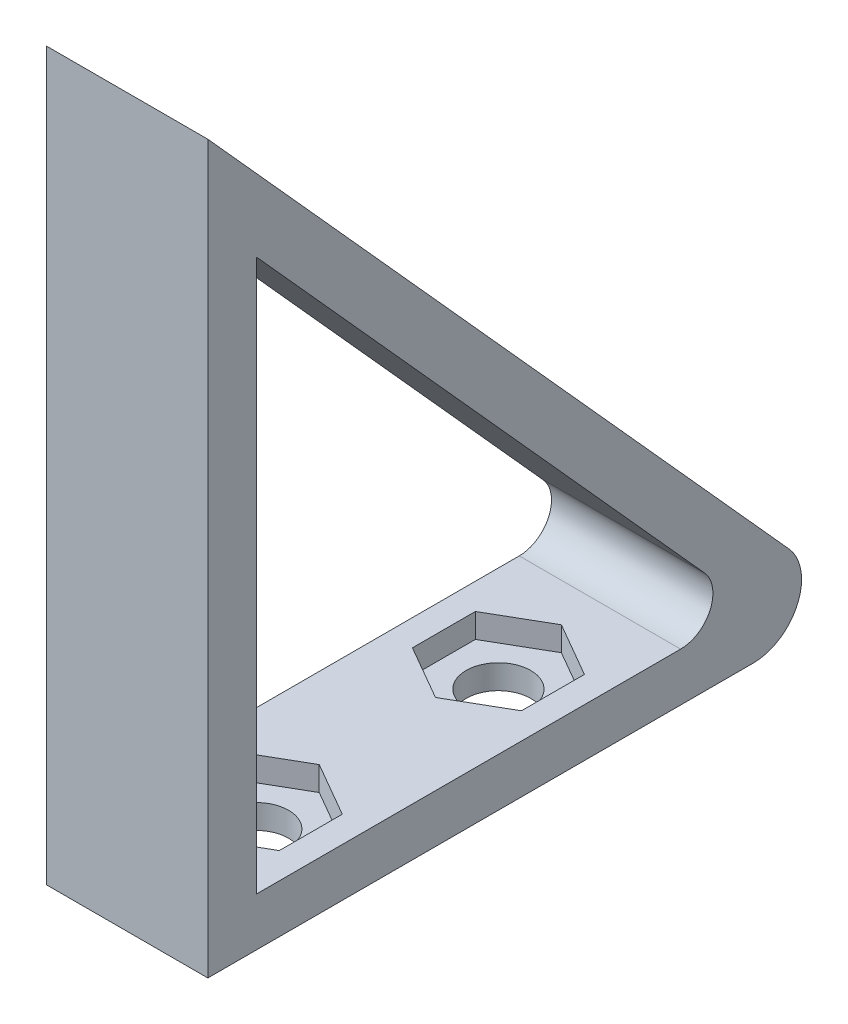
ISO-10303-21;
HEADER;
FILE_DESCRIPTION(('STEP AP214'),'2;1');
FILE_NAME('part.step','',(''),(''),'','','');
FILE_SCHEMA(('AUTOMOTIVE_DESIGN { 1 0 10303 214 1 1 1 1 }'));
ENDSEC;
DATA;
#1=APPLICATION_CONTEXT('core data for automotive mechanical design processes');
#2=APPLICATION_PROTOCOL_DEFINITION('international standard','automotive_design',2000,#1);
#3=PRODUCT_CONTEXT('',#1,'mechanical');
#4=PRODUCT('Part','Part','',(#3));
#5=PRODUCT_RELATED_PRODUCT_CATEGORY('part','',(#4));
#6=PRODUCT_DEFINITION_FORMATION('','',#4);
#7=PRODUCT_DEFINITION_CONTEXT('part definition',#1,'design');
#8=PRODUCT_DEFINITION('design','',#6,#7);
#9=PRODUCT_DEFINITION_SHAPE('','',#8);
#10=(LENGTH_UNIT() NAMED_UNIT(*) SI_UNIT(.MILLI.,.METRE.));
#11=(NAMED_UNIT(*) PLANE_ANGLE_UNIT() SI_UNIT($,.RADIAN.));
#12=(NAMED_UNIT(*) SI_UNIT($,.STERADIAN.) SOLID_ANGLE_UNIT());
#13=UNCERTAINTY_MEASURE_WITH_UNIT(LENGTH_MEASURE(1.E-05),#10,'distance_accuracy_value','');
#14=(GEOMETRIC_REPRESENTATION_CONTEXT(3) GLOBAL_UNCERTAINTY_ASSIGNED_CONTEXT((#13)) GLOBAL_UNIT_ASSIGNED_CONTEXT((#10,
#11,#12)) REPRESENTATION_CONTEXT('',''));
#15=CARTESIAN_POINT('',(0.,0.,0.));
#16=DIRECTION('',(0.,0.,1.));
#17=DIRECTION('',(1.,0.,0.));
#18=AXIS2_PLACEMENT_3D('',#15,#16,#17);
#19=CARTESIAN_POINT('',(-5.,3.,-23.));
#20=DIRECTION('',(0.,-1.,0.));
#21=DIRECTION('',(0.,0.,-1.));
#22=AXIS2_PLACEMENT_3D('',#19,#20,#21);
#23=CYLINDRICAL_SURFACE('',#22,2.00000000000001);
#24=CARTESIAN_POINT('',(-5.,0.,-23.));
#25=DIRECTION('',(0.,-1.,0.));
#26=DIRECTION('',(0.,0.,-1.));
#27=AXIS2_PLACEMENT_3D('',#24,#25,#26);
#28=CIRCLE('',#27,2.00000000000001);
#29=CARTESIAN_POINT('',(-5.,0.,-25.));
#30=VERTEX_POINT('',#29);
#31=EDGE_CURVE('E326',#30,#30,#28,.T.);
#32=ORIENTED_EDGE('',*,*,#31,.T.);
#33=EDGE_LOOP('',(#32));
#34=FACE_BOUND('',#33,.T.);
#35=CARTESIAN_POINT('',(-5.,1.5,-23.));
#36=DIRECTION('',(0.,1.,0.));
#37=DIRECTION('',(0.,0.,1.));
#38=AXIS2_PLACEMENT_3D('',#35,#36,#37);
#39=CIRCLE('',#38,2.00000000000001);
#40=CARTESIAN_POINT('',(-5.,1.5,-21.));
#41=VERTEX_POINT('',#40);
#42=EDGE_CURVE('E330',#41,#41,#39,.F.);
#43=ORIENTED_EDGE('',*,*,#42,.F.);
#44=EDGE_LOOP('',(#43));
#45=FACE_BOUND('',#44,.T.);
#46=ADVANCED_FACE('F39',(#34,#45),#23,.F.);
#47=CARTESIAN_POINT('',(-5.,3.,-8.));
#48=DIRECTION('',(0.,-1.,0.));
#49=DIRECTION('',(0.,0.,-1.));
#50=AXIS2_PLACEMENT_3D('',#47,#48,#49);
#51=CYLINDRICAL_SURFACE('',#50,2.);
#52=CARTESIAN_POINT('',(-5.,0.,-8.));
#53=DIRECTION('',(0.,-1.,0.));
#54=DIRECTION('',(0.,0.,-1.));
#55=AXIS2_PLACEMENT_3D('',#52,#53,#54);
#56=CIRCLE('',#55,2.);
#57=CARTESIAN_POINT('',(-5.,0.,-10.));
#58=VERTEX_POINT('',#57);
#59=EDGE_CURVE('E321',#58,#58,#56,.T.);
#60=ORIENTED_EDGE('',*,*,#59,.T.);
#61=EDGE_LOOP('',(#60));
#62=FACE_BOUND('',#61,.T.);
#63=CARTESIAN_POINT('',(-5.,1.5,-8.));
#64=DIRECTION('',(0.,1.,0.));
#65=DIRECTION('',(0.,0.,1.));
#66=AXIS2_PLACEMENT_3D('',#63,#64,#65);
#67=CIRCLE('',#66,2.);
#68=CARTESIAN_POINT('',(-5.,1.5,-6.));
#69=VERTEX_POINT('',#68);
#70=EDGE_CURVE('E244',#69,#69,#67,.F.);
#71=ORIENTED_EDGE('',*,*,#70,.F.);
#72=EDGE_LOOP('',(#71));
#73=FACE_BOUND('',#72,.T.);
#74=ADVANCED_FACE('F434',(#62,#73),#51,.F.);
#75=CARTESIAN_POINT('',(-10.,0.,-40.5181819934023));
#76=DIRECTION('',(0.,-1.,0.));
#77=DIRECTION('',(0.,0.,-1.));
#78=AXIS2_PLACEMENT_3D('',#75,#76,#77);
#79=PLANE('',#78);
#80=ORIENTED_EDGE('',*,*,#59,.F.);
#81=EDGE_LOOP('',(#80));
#82=FACE_BOUND('',#81,.T.);
#83=ORIENTED_EDGE('',*,*,#31,.F.);
#84=EDGE_LOOP('',(#83));
#85=FACE_BOUND('',#84,.T.);
#86=DIRECTION('',(0.,0.,-1.));
#87=VECTOR('',#86,1.);
#88=CARTESIAN_POINT('',(-10.,0.,-40.5181819934023));
#89=LINE('',#88,#87);
#90=CARTESIAN_POINT('',(-10.,0.,0.));
#91=VERTEX_POINT('',#90);
#92=CARTESIAN_POINT('',(-10.,0.,-33.7800716716897));
#93=VERTEX_POINT('',#92);
#94=EDGE_CURVE('E358',#91,#93,#89,.T.);
#95=ORIENTED_EDGE('',*,*,#94,.T.);
#96=DIRECTION('',(1.,0.,0.));
#97=VECTOR('',#96,1.);
#98=CARTESIAN_POINT('',(-10.,0.,-33.7800716716897));
#99=LINE('',#98,#97);
#100=CARTESIAN_POINT('',(0.,0.,-33.7800716716897));
#101=VERTEX_POINT('',#100);
#102=EDGE_CURVE('E383',#93,#101,#99,.T.);
#103=ORIENTED_EDGE('',*,*,#102,.T.);
#104=DIRECTION('',(0.,0.,-1.));
#105=VECTOR('',#104,1.);
#106=CARTESIAN_POINT('',(0.,0.,-40.5181819934023));
#107=LINE('',#106,#105);
#108=CARTESIAN_POINT('',(0.,0.,0.));
#109=VERTEX_POINT('',#108);
#110=EDGE_CURVE('E354',#109,#101,#107,.T.);
#111=ORIENTED_EDGE('',*,*,#110,.F.);
#112=DIRECTION('',(1.,0.,0.));
#113=VECTOR('',#112,1.);
#114=CARTESIAN_POINT('',(-10.,0.,0.));
#115=LINE('',#114,#113);
#116=EDGE_CURVE('E380',#91,#109,#115,.T.);
#117=ORIENTED_EDGE('',*,*,#116,.F.);
#118=EDGE_LOOP('',(#95,#103,#111,#117));
#119=FACE_BOUND('',#118,.T.);
#120=ADVANCED_FACE('F440',(#82,#85,#119),#79,.T.);
#121=CARTESIAN_POINT('',(-10.,0.,0.));
#122=DIRECTION('',(0.,0.,1.));
#123=DIRECTION('',(1.,0.,0.));
#124=AXIS2_PLACEMENT_3D('',#121,#122,#123);
#125=PLANE('',#124);
#126=DIRECTION('',(0.,-1.,0.));
#127=VECTOR('',#126,1.);
#128=CARTESIAN_POINT('',(0.,0.,0.));
#129=LINE('',#128,#127);
#130=CARTESIAN_POINT('',(0.,45.,0.));
#131=VERTEX_POINT('',#130);
#132=EDGE_CURVE('E363',#131,#109,#129,.T.);
#133=ORIENTED_EDGE('',*,*,#132,.F.);
#134=DIRECTION('',(1.,0.,0.));
#135=VECTOR('',#134,1.);
#136=CARTESIAN_POINT('',(-10.,45.,0.));
#137=LINE('',#136,#135);
#138=CARTESIAN_POINT('',(-10.,45.,0.));
#139=VERTEX_POINT('',#138);
#140=EDGE_CURVE('E370',#139,#131,#137,.T.);
#141=ORIENTED_EDGE('',*,*,#140,.F.);
#142=DIRECTION('',(0.,-1.,0.));
#143=VECTOR('',#142,1.);
#144=CARTESIAN_POINT('',(-10.,0.,0.));
#145=LINE('',#144,#143);
#146=EDGE_CURVE('E366',#139,#91,#145,.T.);
#147=ORIENTED_EDGE('',*,*,#146,.T.);
#148=ORIENTED_EDGE('',*,*,#116,.T.);
#149=EDGE_LOOP('',(#133,#141,#147,#148));
#150=FACE_BOUND('',#149,.T.);
#151=ADVANCED_FACE('F460',(#150),#125,.T.);
#152=CARTESIAN_POINT('',(-10.,45.,0.));
#153=DIRECTION('',(0.,0.669130606358854,-0.743144825477398));
#154=DIRECTION('',(0.,0.743144825477398,0.669130606358854));
#155=AXIS2_PLACEMENT_3D('',#152,#153,#154);
#156=PLANE('',#155);
#157=DIRECTION('',(0.,0.743144825477398,0.669130606358854));
#158=VECTOR('',#157,1.);
#159=CARTESIAN_POINT('',(0.,45.,0.));
#160=LINE('',#159,#158);
#161=CARTESIAN_POINT('',(0.,5.00739181907657,-36.0095061481219));
#162=VERTEX_POINT('',#161);
#163=EDGE_CURVE('E374',#162,#131,#160,.T.);
#164=ORIENTED_EDGE('',*,*,#163,.F.);
#165=DIRECTION('',(1.,0.,0.));
#166=VECTOR('',#165,1.);
#167=CARTESIAN_POINT('',(-10.,5.00739181907656,-36.0095061481219));
#168=LINE('',#167,#166);
#169=CARTESIAN_POINT('',(-10.,5.00739181907657,-36.0095061481219));
#170=VERTEX_POINT('',#169);
#171=EDGE_CURVE('E399',#162,#170,#168,.F.);
#172=ORIENTED_EDGE('',*,*,#171,.T.);
#173=DIRECTION('',(0.,0.743144825477398,0.669130606358854));
#174=VECTOR('',#173,1.);
#175=CARTESIAN_POINT('',(-10.,45.,0.));
#176=LINE('',#175,#174);
#177=EDGE_CURVE('E362',#170,#139,#176,.T.);
#178=ORIENTED_EDGE('',*,*,#177,.T.);
#179=ORIENTED_EDGE('',*,*,#140,.T.);
#180=EDGE_LOOP('',(#164,#172,#178,#179));
#181=FACE_BOUND('',#180,.T.);
#182=ADVANCED_FACE('F457',(#181),#156,.T.);
#183=CARTESIAN_POINT('',(-10.,0.,0.));
#184=DIRECTION('',(-1.,0.,0.));
#185=DIRECTION('',(0.,0.,1.));
#186=AXIS2_PLACEMENT_3D('',#183,#184,#185);
#187=PLANE('',#186);
#188=DIRECTION('',(0.,0.,-1.));
#189=VECTOR('',#188,1.);
#190=CARTESIAN_POINT('',(-10.,3.,-3.));
#191=LINE('',#190,#189);
#192=CARTESIAN_POINT('',(-10.,3.,-3.));
#193=VERTEX_POINT('',#192);
#194=CARTESIAN_POINT('',(-10.,3.,-29.2879981238814));
#195=VERTEX_POINT('',#194);
#196=EDGE_CURVE('E331',#193,#195,#191,.T.);
#197=ORIENTED_EDGE('',*,*,#196,.T.);
#198=CARTESIAN_POINT('',(-10.,5.,-29.2879981238814));
#199=DIRECTION('',(-1.,0.,0.));
#200=DIRECTION('',(0.,0.,1.));
#201=AXIS2_PLACEMENT_3D('',#198,#199,#200);
#202=CIRCLE('',#201,2.);
#203=CARTESIAN_POINT('',(-10.,6.33826121271771,-30.7742877748362));
#204=VERTEX_POINT('',#203);
#205=EDGE_CURVE('E11',#195,#204,#202,.F.);
#206=ORIENTED_EDGE('',*,*,#205,.T.);
#207=DIRECTION('',(0.,0.743144825477398,0.669130606358854));
#208=VECTOR('',#207,1.);
#209=CARTESIAN_POINT('',(-10.,3.,-33.7800716716898));
#210=LINE('',#209,#208);
#211=CARTESIAN_POINT('',(-10.,37.1847328059185,-3.));
#212=VERTEX_POINT('',#211);
#213=EDGE_CURVE('E334',#204,#212,#210,.T.);
#214=ORIENTED_EDGE('',*,*,#213,.T.);
#215=DIRECTION('',(0.,-1.,0.));
#216=VECTOR('',#215,1.);
#217=CARTESIAN_POINT('',(-10.,37.1847328059185,-3.));
#218=LINE('',#217,#216);
#219=EDGE_CURVE('E338',#212,#193,#218,.T.);
#220=ORIENTED_EDGE('',*,*,#219,.T.);
#221=EDGE_LOOP('',(#197,#206,#214,#220));
#222=FACE_BOUND('',#221,.T.);
#223=ORIENTED_EDGE('',*,*,#177,.F.);
#224=CARTESIAN_POINT('',(-10.,3.,-33.7800716716897));
#225=DIRECTION('',(-1.,0.,0.));
#226=DIRECTION('',(0.,0.,1.));
#227=AXIS2_PLACEMENT_3D('',#224,#225,#226);
#228=CIRCLE('',#227,3.);
#229=EDGE_CURVE('E402',#170,#93,#228,.T.);
#230=ORIENTED_EDGE('',*,*,#229,.T.);
#231=ORIENTED_EDGE('',*,*,#94,.F.);
#232=ORIENTED_EDGE('',*,*,#146,.F.);
#233=EDGE_LOOP('',(#223,#230,#231,#232));
#234=FACE_BOUND('',#233,.T.);
#235=ADVANCED_FACE('F425',(#222,#234),#187,.T.);
#236=CARTESIAN_POINT('',(0.,0.,0.));
#237=DIRECTION('',(-1.,0.,0.));
#238=DIRECTION('',(0.,0.,1.));
#239=AXIS2_PLACEMENT_3D('',#236,#237,#238);
#240=PLANE('',#239);
#241=DIRECTION('',(0.,0.743144825477398,0.669130606358854));
#242=VECTOR('',#241,1.);
#243=CARTESIAN_POINT('',(0.,3.,-33.7800716716898));
#244=LINE('',#243,#242);
#245=CARTESIAN_POINT('',(0.,6.33826121271771,-30.7742877748362));
#246=VERTEX_POINT('',#245);
#247=CARTESIAN_POINT('',(0.,37.1847328059185,-3.));
#248=VERTEX_POINT('',#247);
#249=EDGE_CURVE('E345',#246,#248,#244,.T.);
#250=ORIENTED_EDGE('',*,*,#249,.F.);
#251=CARTESIAN_POINT('',(0.,5.,-29.2879981238814));
#252=DIRECTION('',(-1.,0.,0.));
#253=DIRECTION('',(0.,0.,1.));
#254=AXIS2_PLACEMENT_3D('',#251,#252,#253);
#255=CIRCLE('',#254,2.);
#256=CARTESIAN_POINT('',(0.,3.,-29.2879981238814));
#257=VERTEX_POINT('',#256);
#258=EDGE_CURVE('E48',#246,#257,#255,.T.);
#259=ORIENTED_EDGE('',*,*,#258,.T.);
#260=DIRECTION('',(0.,0.,-1.));
#261=VECTOR('',#260,1.);
#262=CARTESIAN_POINT('',(0.,3.,-3.));
#263=LINE('',#262,#261);
#264=CARTESIAN_POINT('',(0.,3.,-3.));
#265=VERTEX_POINT('',#264);
#266=EDGE_CURVE('E325',#265,#257,#263,.T.);
#267=ORIENTED_EDGE('',*,*,#266,.F.);
#268=DIRECTION('',(0.,-1.,0.));
#269=VECTOR('',#268,1.);
#270=CARTESIAN_POINT('',(0.,37.1847328059185,-3.));
#271=LINE('',#270,#269);
#272=EDGE_CURVE('E335',#248,#265,#271,.T.);
#273=ORIENTED_EDGE('',*,*,#272,.F.);
#274=EDGE_LOOP('',(#250,#259,#267,#273));
#275=FACE_BOUND('',#274,.T.);
#276=ORIENTED_EDGE('',*,*,#110,.T.);
#277=CARTESIAN_POINT('',(0.,3.,-33.7800716716897));
#278=DIRECTION('',(-1.,0.,0.));
#279=DIRECTION('',(0.,0.,1.));
#280=AXIS2_PLACEMENT_3D('',#277,#278,#279);
#281=CIRCLE('',#280,3.);
#282=EDGE_CURVE('E396',#101,#162,#281,.F.);
#283=ORIENTED_EDGE('',*,*,#282,.T.);
#284=ORIENTED_EDGE('',*,*,#163,.T.);
#285=ORIENTED_EDGE('',*,*,#132,.T.);
#286=EDGE_LOOP('',(#276,#283,#284,#285));
#287=FACE_BOUND('',#286,.T.);
#288=ADVANCED_FACE('F419',(#275,#287),#240,.F.);
#289=CARTESIAN_POINT('',(-10.,3.,-3.));
#290=DIRECTION('',(0.,-1.,0.));
#291=DIRECTION('',(0.,0.,-1.));
#292=AXIS2_PLACEMENT_3D('',#289,#290,#291);
#293=PLANE('',#292);
#294=DIRECTION('',(0.866025403784439,0.,-0.5));
#295=VECTOR('',#294,1.);
#296=CARTESIAN_POINT('',(-5.,3.,-19.1));
#297=LINE('',#296,#295);
#298=CARTESIAN_POINT('',(-5.,3.,-19.1));
#299=VERTEX_POINT('',#298);
#300=CARTESIAN_POINT('',(-1.62250092524069,3.,-21.05));
#301=VERTEX_POINT('',#300);
#302=EDGE_CURVE('E226',#299,#301,#297,.T.);
#303=ORIENTED_EDGE('',*,*,#302,.F.);
#304=DIRECTION('',(0.866025403784439,0.,0.5));
#305=VECTOR('',#304,1.);
#306=CARTESIAN_POINT('',(-8.3774990747593,3.,-21.05));
#307=LINE('',#306,#305);
#308=CARTESIAN_POINT('',(-8.3774990747593,3.,-21.05));
#309=VERTEX_POINT('',#308);
#310=EDGE_CURVE('E184',#309,#299,#307,.T.);
#311=ORIENTED_EDGE('',*,*,#310,.F.);
#312=DIRECTION('',(0.,0.,1.));
#313=VECTOR('',#312,1.);
#314=CARTESIAN_POINT('',(-8.3774990747593,3.,-24.95));
#315=LINE('',#314,#313);
#316=CARTESIAN_POINT('',(-8.3774990747593,3.,-24.95));
#317=VERTEX_POINT('',#316);
#318=EDGE_CURVE('E206',#317,#309,#315,.T.);
#319=ORIENTED_EDGE('',*,*,#318,.F.);
#320=DIRECTION('',(-0.866025403784439,0.,0.5));
#321=VECTOR('',#320,1.);
#322=CARTESIAN_POINT('',(-4.99999999999999,3.,-26.9));
#323=LINE('',#322,#321);
#324=CARTESIAN_POINT('',(-4.99999999999999,3.,-26.9));
#325=VERTEX_POINT('',#324);
#326=EDGE_CURVE('E210',#325,#317,#323,.T.);
#327=ORIENTED_EDGE('',*,*,#326,.F.);
#328=DIRECTION('',(-0.866025403784439,0.,-0.5));
#329=VECTOR('',#328,1.);
#330=CARTESIAN_POINT('',(-1.62250092524069,3.,-24.95));
#331=LINE('',#330,#329);
#332=CARTESIAN_POINT('',(-1.62250092524069,3.,-24.95));
#333=VERTEX_POINT('',#332);
#334=EDGE_CURVE('E234',#333,#325,#331,.T.);
#335=ORIENTED_EDGE('',*,*,#334,.F.);
#336=DIRECTION('',(0.,0.,-1.));
#337=VECTOR('',#336,1.);
#338=CARTESIAN_POINT('',(-1.62250092524069,3.,-21.05));
#339=LINE('',#338,#337);
#340=EDGE_CURVE('E230',#301,#333,#339,.T.);
#341=ORIENTED_EDGE('',*,*,#340,.F.);
#342=EDGE_LOOP('',(#303,#311,#319,#327,#335,#341));
#343=FACE_BOUND('',#342,.T.);
#344=DIRECTION('',(-0.866025403784438,0.,0.500000000000001));
#345=VECTOR('',#344,1.);
#346=CARTESIAN_POINT('',(-5.,3.,-11.9));
#347=LINE('',#346,#345);
#348=CARTESIAN_POINT('',(-5.,3.,-11.9));
#349=VERTEX_POINT('',#348);
#350=CARTESIAN_POINT('',(-8.37749907475931,3.,-9.95));
#351=VERTEX_POINT('',#350);
#352=EDGE_CURVE('E285',#349,#351,#347,.T.);
#353=ORIENTED_EDGE('',*,*,#352,.F.);
#354=DIRECTION('',(-0.866025403784439,0.,-0.5));
#355=VECTOR('',#354,1.);
#356=CARTESIAN_POINT('',(-1.62250092524069,3.,-9.95));
#357=LINE('',#356,#355);
#358=CARTESIAN_POINT('',(-1.62250092524069,3.,-9.95));
#359=VERTEX_POINT('',#358);
#360=EDGE_CURVE('E282',#359,#349,#357,.T.);
#361=ORIENTED_EDGE('',*,*,#360,.F.);
#362=DIRECTION('',(0.,0.,-1.));
#363=VECTOR('',#362,1.);
#364=CARTESIAN_POINT('',(-1.62250092524069,3.,-6.05));
#365=LINE('',#364,#363);
#366=CARTESIAN_POINT('',(-1.62250092524069,3.,-6.05));
#367=VERTEX_POINT('',#366);
#368=EDGE_CURVE('E261',#367,#359,#365,.T.);
#369=ORIENTED_EDGE('',*,*,#368,.F.);
#370=DIRECTION('',(0.866025403784439,0.,-0.5));
#371=VECTOR('',#370,1.);
#372=CARTESIAN_POINT('',(-5.,3.,-4.1));
#373=LINE('',#372,#371);
#374=CARTESIAN_POINT('',(-5.,3.,-4.1));
#375=VERTEX_POINT('',#374);
#376=EDGE_CURVE('E297',#375,#367,#373,.T.);
#377=ORIENTED_EDGE('',*,*,#376,.F.);
#378=DIRECTION('',(0.866025403784439,0.,0.5));
#379=VECTOR('',#378,1.);
#380=CARTESIAN_POINT('',(-8.37749907475931,3.,-6.05));
#381=LINE('',#380,#379);
#382=CARTESIAN_POINT('',(-8.37749907475931,3.,-6.05));
#383=VERTEX_POINT('',#382);
#384=EDGE_CURVE('E293',#383,#375,#381,.T.);
#385=ORIENTED_EDGE('',*,*,#384,.F.);
#386=DIRECTION('',(0.,0.,1.));
#387=VECTOR('',#386,1.);
#388=CARTESIAN_POINT('',(-8.37749907475931,3.,-9.95));
#389=LINE('',#388,#387);
#390=EDGE_CURVE('E289',#351,#383,#389,.T.);
#391=ORIENTED_EDGE('',*,*,#390,.F.);
#392=EDGE_LOOP('',(#353,#361,#369,#377,#385,#391));
#393=FACE_BOUND('',#392,.T.);
#394=ORIENTED_EDGE('',*,*,#266,.T.);
#395=DIRECTION('',(1.,0.,0.));
#396=VECTOR('',#395,1.);
#397=CARTESIAN_POINT('',(-10.,3.,-29.2879981238814));
#398=LINE('',#397,#396);
#399=EDGE_CURVE('E55',#257,#195,#398,.F.);
#400=ORIENTED_EDGE('',*,*,#399,.T.);
#401=ORIENTED_EDGE('',*,*,#196,.F.);
#402=DIRECTION('',(1.,0.,0.));
#403=VECTOR('',#402,1.);
#404=CARTESIAN_POINT('',(-10.,3.,-3.));
#405=LINE('',#404,#403);
#406=EDGE_CURVE('E351',#193,#265,#405,.T.);
#407=ORIENTED_EDGE('',*,*,#406,.T.);
#408=EDGE_LOOP('',(#394,#400,#401,#407));
#409=FACE_BOUND('',#408,.T.);
#410=ADVANCED_FACE('F448',(#343,#393,#409),#293,.F.);
#411=CARTESIAN_POINT('',(-10.,37.1847328059185,-3.));
#412=DIRECTION('',(0.,0.,1.));
#413=DIRECTION('',(0.,-1.,0.));
#414=AXIS2_PLACEMENT_3D('',#411,#412,#413);
#415=PLANE('',#414);
#416=ORIENTED_EDGE('',*,*,#272,.T.);
#417=ORIENTED_EDGE('',*,*,#406,.F.);
#418=ORIENTED_EDGE('',*,*,#219,.F.);
#419=DIRECTION('',(1.,0.,0.));
#420=VECTOR('',#419,1.);
#421=CARTESIAN_POINT('',(-10.,37.1847328059185,-3.));
#422=LINE('',#421,#420);
#423=EDGE_CURVE('E342',#212,#248,#422,.T.);
#424=ORIENTED_EDGE('',*,*,#423,.T.);
#425=EDGE_LOOP('',(#416,#417,#418,#424));
#426=FACE_BOUND('',#425,.T.);
#427=ADVANCED_FACE('F422',(#426),#415,.F.);
#428=CARTESIAN_POINT('',(-10.,3.,-33.7800716716898));
#429=DIRECTION('',(0.,0.669130606358854,-0.743144825477398));
#430=DIRECTION('',(0.,0.743144825477398,0.669130606358854));
#431=AXIS2_PLACEMENT_3D('',#428,#429,#430);
#432=PLANE('',#431);
#433=ORIENTED_EDGE('',*,*,#213,.F.);
#434=DIRECTION('',(1.,0.,0.));
#435=VECTOR('',#434,1.);
#436=CARTESIAN_POINT('',(0.,6.33826121271771,-30.7742877748362));
#437=LINE('',#436,#435);
#438=EDGE_CURVE('E405',#204,#246,#437,.T.);
#439=ORIENTED_EDGE('',*,*,#438,.T.);
#440=ORIENTED_EDGE('',*,*,#249,.T.);
#441=ORIENTED_EDGE('',*,*,#423,.F.);
#442=EDGE_LOOP('',(#433,#439,#440,#441));
#443=FACE_BOUND('',#442,.T.);
#444=ADVANCED_FACE('F414',(#443),#432,.F.);
#445=CARTESIAN_POINT('',(0.,1.5,0.));
#446=DIRECTION('',(0.,1.,0.));
#447=DIRECTION('',(0.,0.,1.));
#448=AXIS2_PLACEMENT_3D('',#445,#446,#447);
#449=PLANE('',#448);
#450=DIRECTION('',(-0.866025403784439,0.,-0.5));
#451=VECTOR('',#450,1.);
#452=CARTESIAN_POINT('',(-1.62250092524069,1.5,-9.95));
#453=LINE('',#452,#451);
#454=CARTESIAN_POINT('',(-1.62250092524069,1.5,-9.95));
#455=VERTEX_POINT('',#454);
#456=CARTESIAN_POINT('',(-5.,1.5,-11.9));
#457=VERTEX_POINT('',#456);
#458=EDGE_CURVE('E256',#455,#457,#453,.T.);
#459=ORIENTED_EDGE('',*,*,#458,.T.);
#460=DIRECTION('',(-0.866025403784438,0.,0.500000000000001));
#461=VECTOR('',#460,1.);
#462=CARTESIAN_POINT('',(-5.,1.5,-11.9));
#463=LINE('',#462,#461);
#464=CARTESIAN_POINT('',(-8.37749907475931,1.5,-9.95));
#465=VERTEX_POINT('',#464);
#466=EDGE_CURVE('E260',#457,#465,#463,.T.);
#467=ORIENTED_EDGE('',*,*,#466,.T.);
#468=DIRECTION('',(0.,0.,1.));
#469=VECTOR('',#468,1.);
#470=CARTESIAN_POINT('',(-8.37749907475931,1.5,-9.95));
#471=LINE('',#470,#469);
#472=CARTESIAN_POINT('',(-8.37749907475931,1.5,-6.05));
#473=VERTEX_POINT('',#472);
#474=EDGE_CURVE('E265',#465,#473,#471,.T.);
#475=ORIENTED_EDGE('',*,*,#474,.T.);
#476=DIRECTION('',(0.866025403784439,0.,0.5));
#477=VECTOR('',#476,1.);
#478=CARTESIAN_POINT('',(-8.37749907475931,1.5,-6.05));
#479=LINE('',#478,#477);
#480=CARTESIAN_POINT('',(-5.,1.5,-4.1));
#481=VERTEX_POINT('',#480);
#482=EDGE_CURVE('E269',#473,#481,#479,.T.);
#483=ORIENTED_EDGE('',*,*,#482,.T.);
#484=DIRECTION('',(0.866025403784439,0.,-0.5));
#485=VECTOR('',#484,1.);
#486=CARTESIAN_POINT('',(-5.,1.5,-4.1));
#487=LINE('',#486,#485);
#488=CARTESIAN_POINT('',(-1.62250092524069,1.5,-6.05));
#489=VERTEX_POINT('',#488);
#490=EDGE_CURVE('E273',#481,#489,#487,.T.);
#491=ORIENTED_EDGE('',*,*,#490,.T.);
#492=DIRECTION('',(0.,0.,-1.));
#493=VECTOR('',#492,1.);
#494=CARTESIAN_POINT('',(-1.62250092524069,1.5,-6.05));
#495=LINE('',#494,#493);
#496=EDGE_CURVE('E277',#489,#455,#495,.T.);
#497=ORIENTED_EDGE('',*,*,#496,.T.);
#498=EDGE_LOOP('',(#459,#467,#475,#483,#491,#497));
#499=FACE_BOUND('',#498,.T.);
#500=ORIENTED_EDGE('',*,*,#70,.T.);
#501=EDGE_LOOP('',(#500));
#502=FACE_BOUND('',#501,.T.);
#503=ADVANCED_FACE('F451',(#499,#502),#449,.T.);
#504=CARTESIAN_POINT('',(-1.62250092524069,1.5,-9.95));
#505=DIRECTION('',(0.5,0.,-0.866025403784439));
#506=DIRECTION('',(-0.866025403784439,0.,-0.5));
#507=AXIS2_PLACEMENT_3D('',#504,#505,#506);
#508=PLANE('',#507);
#509=ORIENTED_EDGE('',*,*,#360,.T.);
#510=DIRECTION('',(0.,1.,0.));
#511=VECTOR('',#510,1.);
#512=CARTESIAN_POINT('',(-5.,1.5,-11.9));
#513=LINE('',#512,#511);
#514=EDGE_CURVE('E281',#457,#349,#513,.T.);
#515=ORIENTED_EDGE('',*,*,#514,.F.);
#516=ORIENTED_EDGE('',*,*,#458,.F.);
#517=DIRECTION('',(0.,1.,0.));
#518=VECTOR('',#517,1.);
#519=CARTESIAN_POINT('',(-1.62250092524069,1.5,-9.95));
#520=LINE('',#519,#518);
#521=EDGE_CURVE('E227',#455,#359,#520,.T.);
#522=ORIENTED_EDGE('',*,*,#521,.T.);
#523=EDGE_LOOP('',(#509,#515,#516,#522));
#524=FACE_BOUND('',#523,.T.);
#525=ADVANCED_FACE('F489',(#524),#508,.F.);
#526=CARTESIAN_POINT('',(-1.62250092524069,1.5,-6.05));
#527=DIRECTION('',(1.,0.,0.));
#528=DIRECTION('',(0.,0.,-1.));
#529=AXIS2_PLACEMENT_3D('',#526,#527,#528);
#530=PLANE('',#529);
#531=ORIENTED_EDGE('',*,*,#368,.T.);
#532=ORIENTED_EDGE('',*,*,#521,.F.);
#533=ORIENTED_EDGE('',*,*,#496,.F.);
#534=DIRECTION('',(0.,1.,0.));
#535=VECTOR('',#534,1.);
#536=CARTESIAN_POINT('',(-1.62250092524069,1.5,-6.05));
#537=LINE('',#536,#535);
#538=EDGE_CURVE('E306',#489,#367,#537,.T.);
#539=ORIENTED_EDGE('',*,*,#538,.T.);
#540=EDGE_LOOP('',(#531,#532,#533,#539));
#541=FACE_BOUND('',#540,.T.);
#542=ADVANCED_FACE('F495',(#541),#530,.F.);
#543=CARTESIAN_POINT('',(-5.,1.5,-4.1));
#544=DIRECTION('',(0.5,0.,0.866025403784439));
#545=DIRECTION('',(0.866025403784439,0.,-0.5));
#546=AXIS2_PLACEMENT_3D('',#543,#544,#545);
#547=PLANE('',#546);
#548=ORIENTED_EDGE('',*,*,#376,.T.);
#549=ORIENTED_EDGE('',*,*,#538,.F.);
#550=ORIENTED_EDGE('',*,*,#490,.F.);
#551=DIRECTION('',(0.,1.,0.));
#552=VECTOR('',#551,1.);
#553=CARTESIAN_POINT('',(-5.,1.5,-4.1));
#554=LINE('',#553,#552);
#555=EDGE_CURVE('E309',#481,#375,#554,.T.);
#556=ORIENTED_EDGE('',*,*,#555,.T.);
#557=EDGE_LOOP('',(#548,#549,#550,#556));
#558=FACE_BOUND('',#557,.T.);
#559=ADVANCED_FACE('F502',(#558),#547,.F.);
#560=CARTESIAN_POINT('',(-8.37749907475931,1.5,-6.05));
#561=DIRECTION('',(-0.5,0.,0.866025403784438));
#562=DIRECTION('',(0.866025403784439,0.,0.5));
#563=AXIS2_PLACEMENT_3D('',#560,#561,#562);
#564=PLANE('',#563);
#565=ORIENTED_EDGE('',*,*,#384,.T.);
#566=ORIENTED_EDGE('',*,*,#555,.F.);
#567=ORIENTED_EDGE('',*,*,#482,.F.);
#568=DIRECTION('',(0.,1.,0.));
#569=VECTOR('',#568,1.);
#570=CARTESIAN_POINT('',(-8.37749907475931,1.5,-6.05));
#571=LINE('',#570,#569);
#572=EDGE_CURVE('E312',#473,#383,#571,.T.);
#573=ORIENTED_EDGE('',*,*,#572,.T.);
#574=EDGE_LOOP('',(#565,#566,#567,#573));
#575=FACE_BOUND('',#574,.T.);
#576=ADVANCED_FACE('F506',(#575),#564,.F.);
#577=CARTESIAN_POINT('',(-8.37749907475931,1.5,-9.95));
#578=DIRECTION('',(-1.,0.,0.));
#579=DIRECTION('',(0.,0.,1.));
#580=AXIS2_PLACEMENT_3D('',#577,#578,#579);
#581=PLANE('',#580);
#582=ORIENTED_EDGE('',*,*,#390,.T.);
#583=ORIENTED_EDGE('',*,*,#572,.F.);
#584=ORIENTED_EDGE('',*,*,#474,.F.);
#585=DIRECTION('',(0.,1.,0.));
#586=VECTOR('',#585,1.);
#587=CARTESIAN_POINT('',(-8.37749907475931,1.5,-9.95));
#588=LINE('',#587,#586);
#589=EDGE_CURVE('E315',#465,#351,#588,.T.);
#590=ORIENTED_EDGE('',*,*,#589,.T.);
#591=EDGE_LOOP('',(#582,#583,#584,#590));
#592=FACE_BOUND('',#591,.T.);
#593=ADVANCED_FACE('F510',(#592),#581,.F.);
#594=CARTESIAN_POINT('',(-5.,1.5,-11.9));
#595=DIRECTION('',(-0.500000000000001,0.,-0.866025403784438));
#596=DIRECTION('',(-0.866025403784438,0.,0.500000000000001));
#597=AXIS2_PLACEMENT_3D('',#594,#595,#596);
#598=PLANE('',#597);
#599=ORIENTED_EDGE('',*,*,#352,.T.);
#600=ORIENTED_EDGE('',*,*,#589,.F.);
#601=ORIENTED_EDGE('',*,*,#466,.F.);
#602=ORIENTED_EDGE('',*,*,#514,.T.);
#603=EDGE_LOOP('',(#599,#600,#601,#602));
#604=FACE_BOUND('',#603,.T.);
#605=ADVANCED_FACE('F514',(#604),#598,.F.);
#606=CARTESIAN_POINT('',(0.,1.5,0.));
#607=DIRECTION('',(0.,1.,0.));
#608=DIRECTION('',(0.,0.,1.));
#609=AXIS2_PLACEMENT_3D('',#606,#607,#608);
#610=PLANE('',#609);
#611=DIRECTION('',(0.866025403784439,0.,0.5));
#612=VECTOR('',#611,1.);
#613=CARTESIAN_POINT('',(-8.3774990747593,1.5,-21.05));
#614=LINE('',#613,#612);
#615=CARTESIAN_POINT('',(-8.3774990747593,1.5,-21.05));
#616=VERTEX_POINT('',#615);
#617=CARTESIAN_POINT('',(-5.,1.5,-19.1));
#618=VERTEX_POINT('',#617);
#619=EDGE_CURVE('E181',#616,#618,#614,.T.);
#620=ORIENTED_EDGE('',*,*,#619,.T.);
#621=DIRECTION('',(0.866025403784439,0.,-0.5));
#622=VECTOR('',#621,1.);
#623=CARTESIAN_POINT('',(-5.,1.5,-19.1));
#624=LINE('',#623,#622);
#625=CARTESIAN_POINT('',(-1.62250092524069,1.5,-21.05));
#626=VERTEX_POINT('',#625);
#627=EDGE_CURVE('E193',#618,#626,#624,.T.);
#628=ORIENTED_EDGE('',*,*,#627,.T.);
#629=DIRECTION('',(0.,0.,-1.));
#630=VECTOR('',#629,1.);
#631=CARTESIAN_POINT('',(-1.62250092524069,1.5,-21.05));
#632=LINE('',#631,#630);
#633=CARTESIAN_POINT('',(-1.62250092524069,1.5,-24.95));
#634=VERTEX_POINT('',#633);
#635=EDGE_CURVE('E199',#626,#634,#632,.T.);
#636=ORIENTED_EDGE('',*,*,#635,.T.);
#637=DIRECTION('',(-0.866025403784439,0.,-0.5));
#638=VECTOR('',#637,1.);
#639=CARTESIAN_POINT('',(-1.62250092524069,1.5,-24.95));
#640=LINE('',#639,#638);
#641=CARTESIAN_POINT('',(-4.99999999999999,1.5,-26.9));
#642=VERTEX_POINT('',#641);
#643=EDGE_CURVE('E215',#634,#642,#640,.T.);
#644=ORIENTED_EDGE('',*,*,#643,.T.);
#645=DIRECTION('',(-0.866025403784439,0.,0.5));
#646=VECTOR('',#645,1.);
#647=CARTESIAN_POINT('',(-4.99999999999999,1.5,-26.9));
#648=LINE('',#647,#646);
#649=CARTESIAN_POINT('',(-8.3774990747593,1.5,-24.95));
#650=VERTEX_POINT('',#649);
#651=EDGE_CURVE('E219',#642,#650,#648,.T.);
#652=ORIENTED_EDGE('',*,*,#651,.T.);
#653=DIRECTION('',(0.,0.,1.));
#654=VECTOR('',#653,1.);
#655=CARTESIAN_POINT('',(-8.3774990747593,1.5,-24.95));
#656=LINE('',#655,#654);
#657=EDGE_CURVE('E190',#650,#616,#656,.T.);
#658=ORIENTED_EDGE('',*,*,#657,.T.);
#659=EDGE_LOOP('',(#620,#628,#636,#644,#652,#658));
#660=FACE_BOUND('',#659,.T.);
#661=ORIENTED_EDGE('',*,*,#42,.T.);
#662=EDGE_LOOP('',(#661));
#663=FACE_BOUND('',#662,.T.);
#664=ADVANCED_FACE('F201',(#660,#663),#610,.T.);
#665=CARTESIAN_POINT('',(-8.3774990747593,1.5,-21.05));
#666=DIRECTION('',(-0.5,0.,0.866025403784438));
#667=DIRECTION('',(0.866025403784439,0.,0.5));
#668=AXIS2_PLACEMENT_3D('',#665,#666,#667);
#669=PLANE('',#668);
#670=ORIENTED_EDGE('',*,*,#310,.T.);
#671=DIRECTION('',(0.,1.,0.));
#672=VECTOR('',#671,1.);
#673=CARTESIAN_POINT('',(-5.,1.5,-19.1));
#674=LINE('',#673,#672);
#675=EDGE_CURVE('E177',#618,#299,#674,.T.);
#676=ORIENTED_EDGE('',*,*,#675,.F.);
#677=ORIENTED_EDGE('',*,*,#619,.F.);
#678=DIRECTION('',(0.,1.,0.));
#679=VECTOR('',#678,1.);
#680=CARTESIAN_POINT('',(-8.3774990747593,1.5,-21.05));
#681=LINE('',#680,#679);
#682=EDGE_CURVE('E241',#616,#309,#681,.T.);
#683=ORIENTED_EDGE('',*,*,#682,.T.);
#684=EDGE_LOOP('',(#670,#676,#677,#683));
#685=FACE_BOUND('',#684,.T.);
#686=ADVANCED_FACE('F179',(#685),#669,.F.);
#687=CARTESIAN_POINT('',(-8.3774990747593,1.5,-24.95));
#688=DIRECTION('',(-1.,0.,0.));
#689=DIRECTION('',(0.,0.,1.));
#690=AXIS2_PLACEMENT_3D('',#687,#688,#689);
#691=PLANE('',#690);
#692=ORIENTED_EDGE('',*,*,#318,.T.);
#693=ORIENTED_EDGE('',*,*,#682,.F.);
#694=ORIENTED_EDGE('',*,*,#657,.F.);
#695=DIRECTION('',(0.,1.,0.));
#696=VECTOR('',#695,1.);
#697=CARTESIAN_POINT('',(-8.3774990747593,1.5,-24.95));
#698=LINE('',#697,#696);
#699=EDGE_CURVE('E245',#650,#317,#698,.T.);
#700=ORIENTED_EDGE('',*,*,#699,.T.);
#701=EDGE_LOOP('',(#692,#693,#694,#700));
#702=FACE_BOUND('',#701,.T.);
#703=ADVANCED_FACE('F538',(#702),#691,.F.);
#704=CARTESIAN_POINT('',(-4.99999999999999,1.5,-26.9));
#705=DIRECTION('',(-0.5,0.,-0.866025403784439));
#706=DIRECTION('',(-0.866025403784439,0.,0.5));
#707=AXIS2_PLACEMENT_3D('',#704,#705,#706);
#708=PLANE('',#707);
#709=ORIENTED_EDGE('',*,*,#326,.T.);
#710=ORIENTED_EDGE('',*,*,#699,.F.);
#711=ORIENTED_EDGE('',*,*,#651,.F.);
#712=DIRECTION('',(0.,1.,0.));
#713=VECTOR('',#712,1.);
#714=CARTESIAN_POINT('',(-4.99999999999999,1.5,-26.9));
#715=LINE('',#714,#713);
#716=EDGE_CURVE('E248',#642,#325,#715,.T.);
#717=ORIENTED_EDGE('',*,*,#716,.T.);
#718=EDGE_LOOP('',(#709,#710,#711,#717));
#719=FACE_BOUND('',#718,.T.);
#720=ADVANCED_FACE('F542',(#719),#708,.F.);
#721=CARTESIAN_POINT('',(-1.62250092524069,1.5,-24.95));
#722=DIRECTION('',(0.5,0.,-0.866025403784439));
#723=DIRECTION('',(-0.866025403784439,0.,-0.5));
#724=AXIS2_PLACEMENT_3D('',#721,#722,#723);
#725=PLANE('',#724);
#726=ORIENTED_EDGE('',*,*,#334,.T.);
#727=ORIENTED_EDGE('',*,*,#716,.F.);
#728=ORIENTED_EDGE('',*,*,#643,.F.);
#729=DIRECTION('',(0.,1.,0.));
#730=VECTOR('',#729,1.);
#731=CARTESIAN_POINT('',(-1.62250092524069,1.5,-24.95));
#732=LINE('',#731,#730);
#733=EDGE_CURVE('E251',#634,#333,#732,.T.);
#734=ORIENTED_EDGE('',*,*,#733,.T.);
#735=EDGE_LOOP('',(#726,#727,#728,#734));
#736=FACE_BOUND('',#735,.T.);
#737=ADVANCED_FACE('F546',(#736),#725,.F.);
#738=CARTESIAN_POINT('',(-1.62250092524069,1.5,-21.05));
#739=DIRECTION('',(1.,0.,0.));
#740=DIRECTION('',(0.,0.,-1.));
#741=AXIS2_PLACEMENT_3D('',#738,#739,#740);
#742=PLANE('',#741);
#743=ORIENTED_EDGE('',*,*,#340,.T.);
#744=ORIENTED_EDGE('',*,*,#733,.F.);
#745=ORIENTED_EDGE('',*,*,#635,.F.);
#746=DIRECTION('',(0.,1.,0.));
#747=VECTOR('',#746,1.);
#748=CARTESIAN_POINT('',(-1.62250092524069,1.5,-21.05));
#749=LINE('',#748,#747);
#750=EDGE_CURVE('E189',#626,#301,#749,.T.);
#751=ORIENTED_EDGE('',*,*,#750,.T.);
#752=EDGE_LOOP('',(#743,#744,#745,#751));
#753=FACE_BOUND('',#752,.T.);
#754=ADVANCED_FACE('F550',(#753),#742,.F.);
#755=CARTESIAN_POINT('',(-5.,1.5,-19.1));
#756=DIRECTION('',(0.5,0.,0.866025403784438));
#757=DIRECTION('',(0.866025403784439,0.,-0.5));
#758=AXIS2_PLACEMENT_3D('',#755,#756,#757);
#759=PLANE('',#758);
#760=ORIENTED_EDGE('',*,*,#302,.T.);
#761=ORIENTED_EDGE('',*,*,#750,.F.);
#762=ORIENTED_EDGE('',*,*,#627,.F.);
#763=ORIENTED_EDGE('',*,*,#675,.T.);
#764=EDGE_LOOP('',(#760,#761,#762,#763));
#765=FACE_BOUND('',#764,.T.);
#766=ADVANCED_FACE('F194',(#765),#759,.F.);
#767=CARTESIAN_POINT('',(-10.,3.,-33.7800716716897));
#768=DIRECTION('',(1.,0.,0.));
#769=DIRECTION('',(0.,0.,-1.));
#770=AXIS2_PLACEMENT_3D('',#767,#768,#769);
#771=CYLINDRICAL_SURFACE('',#770,3.);
#772=ORIENTED_EDGE('',*,*,#229,.F.);
#773=ORIENTED_EDGE('',*,*,#171,.F.);
#774=ORIENTED_EDGE('',*,*,#282,.F.);
#775=ORIENTED_EDGE('',*,*,#102,.F.);
#776=EDGE_LOOP('',(#772,#773,#774,#775));
#777=FACE_BOUND('',#776,.T.);
#778=ADVANCED_FACE('F428',(#777),#771,.T.);
#779=CARTESIAN_POINT('',(-10.,5.,-29.2879981238814));
#780=DIRECTION('',(-1.,0.,0.));
#781=DIRECTION('',(0.,0.,1.));
#782=AXIS2_PLACEMENT_3D('',#779,#780,#781);
#783=CYLINDRICAL_SURFACE('',#782,2.);
#784=ORIENTED_EDGE('',*,*,#205,.F.);
#785=ORIENTED_EDGE('',*,*,#399,.F.);
#786=ORIENTED_EDGE('',*,*,#258,.F.);
#787=ORIENTED_EDGE('',*,*,#438,.F.);
#788=EDGE_LOOP('',(#784,#785,#786,#787));
#789=FACE_BOUND('',#788,.T.);
#790=ADVANCED_FACE('F41',(#789),#783,.F.);
#791=CLOSED_SHELL('',(#46,#74,#120,#151,#182,#235,#288,#410,#427,#444,#503,#525,#542,#559,#576,
#593,#605,#664,#686,#703,#720,#737,#754,#766,#778,#790));
#792=MANIFOLD_SOLID_BREP('B2',#791);
#793=ADVANCED_BREP_SHAPE_REPRESENTATION('',(#18,#792),#14);
#794=SHAPE_DEFINITION_REPRESENTATION(#9,#793);
ENDSEC;
END-ISO-10303-21;
